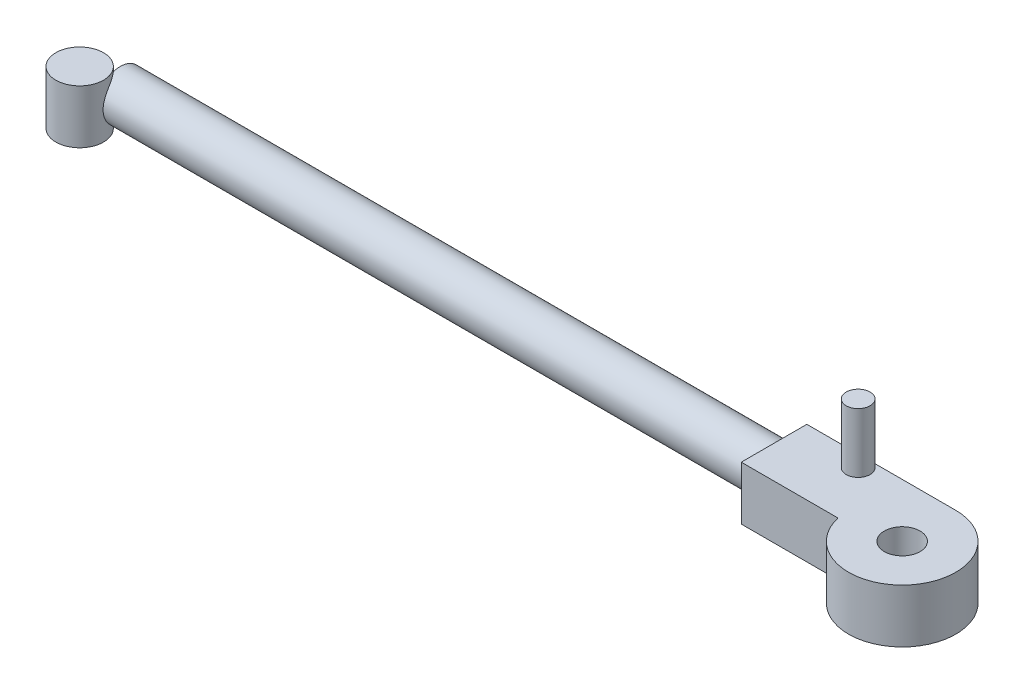
ISO-10303-21;
HEADER;
FILE_DESCRIPTION(('STEP AP214'),'2;1');
FILE_NAME('part.step','',(''),(''),'','','');
FILE_SCHEMA(('AUTOMOTIVE_DESIGN { 1 0 10303 214 1 1 1 1 }'));
ENDSEC;
DATA;
#1=APPLICATION_CONTEXT('core data for automotive mechanical design processes');
#2=APPLICATION_PROTOCOL_DEFINITION('international standard','automotive_design',2000,#1);
#3=PRODUCT_CONTEXT('',#1,'mechanical');
#4=PRODUCT('Part','Part','',(#3));
#5=PRODUCT_RELATED_PRODUCT_CATEGORY('part','',(#4));
#6=PRODUCT_DEFINITION_FORMATION('','',#4);
#7=PRODUCT_DEFINITION_CONTEXT('part definition',#1,'design');
#8=PRODUCT_DEFINITION('design','',#6,#7);
#9=PRODUCT_DEFINITION_SHAPE('','',#8);
#10=(LENGTH_UNIT() NAMED_UNIT(*) SI_UNIT(.MILLI.,.METRE.));
#11=(NAMED_UNIT(*) PLANE_ANGLE_UNIT() SI_UNIT($,.RADIAN.));
#12=(NAMED_UNIT(*) SI_UNIT($,.STERADIAN.) SOLID_ANGLE_UNIT());
#13=UNCERTAINTY_MEASURE_WITH_UNIT(LENGTH_MEASURE(1.E-05),#10,'distance_accuracy_value','');
#14=(GEOMETRIC_REPRESENTATION_CONTEXT(3) GLOBAL_UNCERTAINTY_ASSIGNED_CONTEXT((#13)) GLOBAL_UNIT_ASSIGNED_CONTEXT((#10,
#11,#12)) REPRESENTATION_CONTEXT('',''));
#15=CARTESIAN_POINT('',(0.,0.,0.));
#16=DIRECTION('',(0.,0.,1.));
#17=DIRECTION('',(1.,0.,0.));
#18=AXIS2_PLACEMENT_3D('',#15,#16,#17);
#19=CARTESIAN_POINT('',(-135.,4.74328423365478,-3.78478857369662));
#20=DIRECTION('',(1.,0.,0.));
#21=DIRECTION('',(0.,0.,-1.));
#22=AXIS2_PLACEMENT_3D('',#19,#20,#21);
#23=CYLINDRICAL_SURFACE('',#22,3.85262349560247);
#24=CARTESIAN_POINT('',(-25.,4.74328423365478,-3.78478857369658));
#25=DIRECTION('',(1.,0.,0.));
#26=DIRECTION('',(0.,0.,-1.));
#27=AXIS2_PLACEMENT_3D('',#24,#25,#26);
#28=CIRCLE('',#27,3.85262349560247);
#29=CARTESIAN_POINT('',(-25.,4.74328423365478,-7.63741206929905));
#30=VERTEX_POINT('',#29);
#31=EDGE_CURVE('E43',#30,#30,#28,.F.);
#32=ORIENTED_EDGE('',*,*,#31,.T.);
#33=EDGE_LOOP('',(#32));
#34=FACE_BOUND('',#33,.T.);
#35=CARTESIAN_POINT('',(-135.,1.06288997308922,-2.64575131106458));
#36=CARTESIAN_POINT('',(-134.943606676514,1.08265664730043,-2.58184082844176));
#37=CARTESIAN_POINT('',(-134.889631376872,1.10471910825381,-2.51648775943947));
#38=CARTESIAN_POINT('',(-134.78672829565,1.15377589624757,-2.38367274714249));
#39=CARTESIAN_POINT('',(-134.737801504059,1.18077118772905,-2.31621039359331));
#40=CARTESIAN_POINT('',(-134.64538650559,1.2399257369713,-2.18021030261975));
#41=CARTESIAN_POINT('',(-134.601880375926,1.27206712812292,-2.11167700052142));
#42=CARTESIAN_POINT('',(-134.520208441248,1.34175667532342,-1.97419350213062));
#43=CARTESIAN_POINT('',(-134.482041864109,1.37930404804451,-1.90524336762155));
#44=CARTESIAN_POINT('',(-134.410936314451,1.45995009583037,-1.76766295618624));
#45=CARTESIAN_POINT('',(-134.378008498998,1.50306027383837,-1.69903365625077));
#46=CARTESIAN_POINT('',(-134.317300929974,1.59471058146183,-1.56309688443208));
#47=CARTESIAN_POINT('',(-134.28952319808,1.64325283150981,-1.49578994087298));
#48=CARTESIAN_POINT('',(-134.238859072506,1.74552751627336,-1.3633932476687));
#49=CARTESIAN_POINT('',(-134.215969572147,1.79925662280118,-1.29830211203113));
#50=CARTESIAN_POINT('',(-134.174659551844,1.91166719587524,-1.17100444541195));
#51=CARTESIAN_POINT('',(-134.156240804846,1.9703506147374,-1.10879906670605));
#52=CARTESIAN_POINT('',(-134.123537793678,2.09185176586553,-0.988385167117746));
#53=CARTESIAN_POINT('',(-134.109223684032,2.15463535492963,-0.930150269827159));
#54=CARTESIAN_POINT('',(-134.084042420946,2.28435164710833,-0.817678638777406));
#55=CARTESIAN_POINT('',(-134.073176480346,2.35128580024528,-0.763443316943759));
#56=CARTESIAN_POINT('',(-134.044965588371,2.55778185174937,-0.607367893490012));
#57=CARTESIAN_POINT('',(-134.032005509207,2.7030456031453,-0.512150123301979));
#58=CARTESIAN_POINT('',(-134.012617018989,3.02374659549035,-0.331702393716801));
#59=CARTESIAN_POINT('',(-134.007174109197,3.20070518608334,-0.249093579176077));
#60=CARTESIAN_POINT('',(-134.00095805095,3.56523801055993,-0.111528767745784));
#61=CARTESIAN_POINT('',(-134.000186058576,3.75281486093224,-0.0565796198753316));
#62=CARTESIAN_POINT('',(-133.999948450588,4.04765779670299,0.00601925635413154));
#63=CARTESIAN_POINT('',(-134.000049892956,4.15287509142319,0.0238212807323373));
#64=CARTESIAN_POINT('',(-134.000296693803,4.36445302704649,0.0506452883912304));
#65=CARTESIAN_POINT('',(-134.000442054971,4.47081373755942,0.0596667340248698));
#66=CARTESIAN_POINT('',(-134.000590367886,4.68392193110348,0.0688544675444531));
#67=CARTESIAN_POINT('',(-134.000593305091,4.79066945251417,0.0690198512527872));
#68=CARTESIAN_POINT('',(-134.000455148778,5.00381078975653,0.0604952552712044));
#69=CARTESIAN_POINT('',(-134.00031405602,5.1102046074532,0.0518053223481299));
#70=CARTESIAN_POINT('',(-134.000058766123,5.32352647189183,0.0254284245893637));
#71=CARTESIAN_POINT('',(-133.999945013848,5.43043775755378,0.00760574621272882));
#72=CARTESIAN_POINT('',(-134.000108919298,5.64238172324931,-0.0369813765596569));
#73=CARTESIAN_POINT('',(-134.000386586221,5.74741435906984,-0.0637460311091809));
#74=CARTESIAN_POINT('',(-134.001864811945,5.95488393368964,-0.126036231781734));
#75=CARTESIAN_POINT('',(-134.003065692133,6.05731995573136,-0.16156482586168));
#76=CARTESIAN_POINT('',(-134.007076175629,6.25885952053703,-0.24113484695921));
#77=CARTESIAN_POINT('',(-134.009886558347,6.35796142410333,-0.285180391501667));
#78=CARTESIAN_POINT('',(-134.017919645168,6.55167021463186,-0.381247482868387));
#79=CARTESIAN_POINT('',(-134.023133430561,6.64629230629894,-0.43323907023291));
#80=CARTESIAN_POINT('',(-134.036880335786,6.83062065194853,-0.544829748617848));
#81=CARTESIAN_POINT('',(-134.045411522007,6.92032973488712,-0.604424394477378));
#82=CARTESIAN_POINT('',(-134.066764849127,7.09403528912956,-0.730580629394597));
#83=CARTESIAN_POINT('',(-134.079582544275,7.17803757108231,-0.797134951274335));
#84=CARTESIAN_POINT('',(-134.110513089401,7.33966253104738,-0.936472210764484));
#85=CARTESIAN_POINT('',(-134.128625218343,7.4172860759223,-1.00925429927567));
#86=CARTESIAN_POINT('',(-134.169417354527,7.55955818571368,-1.15405122193267));
#87=CARTESIAN_POINT('',(-134.191620911953,7.62474755998386,-1.22566874763973));
#88=CARTESIAN_POINT('',(-134.241988653957,7.74862853756064,-1.37235661784976));
#89=CARTESIAN_POINT('',(-134.270152751628,7.80732023558711,-1.44742691199742));
#90=CARTESIAN_POINT('',(-134.332957823839,7.91782379825937,-1.59987137421438));
#91=CARTESIAN_POINT('',(-134.367597288963,7.96963726142676,-1.67724500184698));
#92=CARTESIAN_POINT('',(-134.443654054828,8.06618596399595,-1.83301036678112));
#93=CARTESIAN_POINT('',(-134.485069497778,8.11092313693264,-1.91140181961385));
#94=CARTESIAN_POINT('',(-134.594369517258,8.21127556003738,-2.1019921184746));
#95=CARTESIAN_POINT('',(-134.665938571351,8.26317866404827,-2.21408964498685));
#96=CARTESIAN_POINT('',(-134.783602743233,8.33074476462111,-2.37894589849595));
#97=CARTESIAN_POINT('',(-134.824568114324,8.3515607117863,-2.43337887637825));
#98=CARTESIAN_POINT('',(-134.909820705549,8.38997585720985,-2.54076592851418));
#99=CARTESIAN_POINT('',(-134.954108129271,8.40757485809401,-2.59371991185606));
#100=CARTESIAN_POINT('',(-135.,8.42367849422034,-2.64575131106458));
#101=B_SPLINE_CURVE_WITH_KNOTS('',3,(#35,#36,#37,#38,#39,#40,#41,#42,#43,#44,#45,#46,#47,#48,
#49,#50,#51,#52,#53,#54,#55,#56,#57,#58,#59,#60,#61,#62,#63,#64,#65,#66,#67,#68,#69,#70,#71,#72,
#73,#74,#75,#76,#77,#78,#79,#80,#81,#82,#83,#84,#85,#86,#87,#88,#89,#90,#91,#92,#93,#94,#95,#96,
#97,#98,#99,#100),.UNSPECIFIED.,.F.,.F.,(4,2,2,2,2,2,2,2,2,2,2,2,2,2,2,2,2,2,2,2,2,2,2,2,2,2,2,
2,2,2,2,2,4),(0.,0.262434294699367,0.524919954179303,0.786513306815256,1.04806879259989,
1.31017406826571,1.57238201711561,1.83442282251915,2.09656737510342,2.3567544772708,
2.61703299500729,3.13755491549896,3.72135162878626,4.30529282936621,4.62511898578728,
4.94496472437691,5.2648431182039,5.58471982269265,5.90949405454127,6.23427591975086,
6.55917089850702,6.88422334242559,7.2080791512543,7.53174647672201,7.85507914648548,
8.17836780281419,8.47600580409694,8.77363946599083,9.07120383541307,9.3686867569726,
9.79534871815055,10.0089163841915,10.2224971491794),.UNSPECIFIED.);
#102=CARTESIAN_POINT('',(-135.,1.06288997308922,-2.64575131106458));
#103=VERTEX_POINT('',#102);
#104=CARTESIAN_POINT('',(-135.,8.42367849422033,-2.64575131106458));
#105=VERTEX_POINT('',#104);
#106=EDGE_CURVE('E49',#103,#105,#101,.T.);
#107=ORIENTED_EDGE('',*,*,#106,.F.);
#108=CARTESIAN_POINT('',(-135.,4.74328423365478,-3.78478857369662));
#109=DIRECTION('',(-1.,0.,0.));
#110=DIRECTION('',(0.,0.,1.));
#111=AXIS2_PLACEMENT_3D('',#108,#109,#110);
#112=CIRCLE('',#111,3.85262349560247);
#113=EDGE_CURVE('E165',#105,#103,#112,.T.);
#114=ORIENTED_EDGE('',*,*,#113,.F.);
#115=EDGE_LOOP('',(#107,#114));
#116=FACE_BOUND('',#115,.T.);
#117=ADVANCED_FACE('F35',(#34,#116),#23,.T.);
#118=CARTESIAN_POINT('',(-135.,4.74328423365478,-3.78478857369662));
#119=DIRECTION('',(-1.,0.,0.));
#120=DIRECTION('',(0.,0.,1.));
#121=AXIS2_PLACEMENT_3D('',#118,#119,#120);
#122=PLANE('',#121);
#123=ORIENTED_EDGE('',*,*,#113,.T.);
#124=DIRECTION('',(0.,-1.,0.));
#125=VECTOR('',#124,1.);
#126=CARTESIAN_POINT('',(-135.,20.3137084989848,-2.64575131106458));
#127=LINE('',#126,#125);
#128=EDGE_CURVE('E11',#103,#105,#127,.F.);
#129=ORIENTED_EDGE('',*,*,#128,.T.);
#130=EDGE_LOOP('',(#123,#129));
#131=FACE_BOUND('',#130,.T.);
#132=ADVANCED_FACE('F146',(#131),#122,.T.);
#133=CARTESIAN_POINT('',(0.,9.,2.));
#134=DIRECTION('',(0.,0.,-1.));
#135=DIRECTION('',(-1.,0.,0.));
#136=AXIS2_PLACEMENT_3D('',#133,#134,#135);
#137=PLANE('',#136);
#138=DIRECTION('',(1.,0.,0.));
#139=VECTOR('',#138,1.);
#140=CARTESIAN_POINT('',(0.,0.,2.));
#141=LINE('',#140,#139);
#142=CARTESIAN_POINT('',(-25.,0.,2.));
#143=VERTEX_POINT('',#142);
#144=CARTESIAN_POINT('',(-8.77496438739212,0.,2.));
#145=VERTEX_POINT('',#144);
#146=EDGE_CURVE('E111',#143,#145,#141,.T.);
#147=ORIENTED_EDGE('',*,*,#146,.T.);
#148=DIRECTION('',(0.,-1.,0.));
#149=VECTOR('',#148,1.);
#150=CARTESIAN_POINT('',(-8.77496438739212,9.,2.));
#151=LINE('',#150,#149);
#152=CARTESIAN_POINT('',(-8.77496438739212,9.,2.));
#153=VERTEX_POINT('',#152);
#154=EDGE_CURVE('E124',#153,#145,#151,.T.);
#155=ORIENTED_EDGE('',*,*,#154,.F.);
#156=DIRECTION('',(1.,0.,0.));
#157=VECTOR('',#156,1.);
#158=CARTESIAN_POINT('',(0.,9.,2.));
#159=LINE('',#158,#157);
#160=CARTESIAN_POINT('',(-25.,9.,2.));
#161=VERTEX_POINT('',#160);
#162=EDGE_CURVE('E105',#161,#153,#159,.T.);
#163=ORIENTED_EDGE('',*,*,#162,.F.);
#164=DIRECTION('',(0.,-1.,0.));
#165=VECTOR('',#164,1.);
#166=CARTESIAN_POINT('',(-25.,9.,2.));
#167=LINE('',#166,#165);
#168=EDGE_CURVE('E110',#161,#143,#167,.T.);
#169=ORIENTED_EDGE('',*,*,#168,.T.);
#170=EDGE_LOOP('',(#147,#155,#163,#169));
#171=FACE_BOUND('',#170,.T.);
#172=ADVANCED_FACE('F37',(#171),#137,.F.);
#173=CARTESIAN_POINT('',(0.,9.,0.));
#174=DIRECTION('',(0.,-1.,0.));
#175=DIRECTION('',(0.,0.,-1.));
#176=AXIS2_PLACEMENT_3D('',#173,#174,#175);
#177=CYLINDRICAL_SURFACE('',#176,9.);
#178=CARTESIAN_POINT('',(0.,0.,0.));
#179=DIRECTION('',(0.,1.,0.));
#180=DIRECTION('',(0.,0.,1.));
#181=AXIS2_PLACEMENT_3D('',#178,#179,#180);
#182=CIRCLE('',#181,9.);
#183=CARTESIAN_POINT('',(0.,0.,-9.));
#184=VERTEX_POINT('',#183);
#185=EDGE_CURVE('E114',#145,#184,#182,.T.);
#186=ORIENTED_EDGE('',*,*,#185,.T.);
#187=DIRECTION('',(0.,-1.,0.));
#188=VECTOR('',#187,1.);
#189=CARTESIAN_POINT('',(0.,9.,-9.));
#190=LINE('',#189,#188);
#191=CARTESIAN_POINT('',(0.,9.,-9.));
#192=VERTEX_POINT('',#191);
#193=EDGE_CURVE('E122',#192,#184,#190,.T.);
#194=ORIENTED_EDGE('',*,*,#193,.F.);
#195=CARTESIAN_POINT('',(0.,9.,0.));
#196=DIRECTION('',(0.,1.,0.));
#197=DIRECTION('',(0.,0.,1.));
#198=AXIS2_PLACEMENT_3D('',#195,#196,#197);
#199=CIRCLE('',#198,9.);
#200=EDGE_CURVE('E86',#153,#192,#199,.T.);
#201=ORIENTED_EDGE('',*,*,#200,.F.);
#202=ORIENTED_EDGE('',*,*,#154,.T.);
#203=EDGE_LOOP('',(#186,#194,#201,#202));
#204=FACE_BOUND('',#203,.T.);
#205=ADVANCED_FACE('F142',(#204),#177,.T.);
#206=CARTESIAN_POINT('',(0.,9.,-9.));
#207=DIRECTION('',(0.,0.,1.));
#208=DIRECTION('',(1.,0.,0.));
#209=AXIS2_PLACEMENT_3D('',#206,#207,#208);
#210=PLANE('',#209);
#211=DIRECTION('',(-1.,0.,0.));
#212=VECTOR('',#211,1.);
#213=CARTESIAN_POINT('',(0.,0.,-9.));
#214=LINE('',#213,#212);
#215=CARTESIAN_POINT('',(-25.,0.,-9.));
#216=VERTEX_POINT('',#215);
#217=EDGE_CURVE('E117',#184,#216,#214,.T.);
#218=ORIENTED_EDGE('',*,*,#217,.T.);
#219=DIRECTION('',(0.,-1.,0.));
#220=VECTOR('',#219,1.);
#221=CARTESIAN_POINT('',(-25.,9.,-9.));
#222=LINE('',#221,#220);
#223=CARTESIAN_POINT('',(-25.,9.,-9.));
#224=VERTEX_POINT('',#223);
#225=EDGE_CURVE('E104',#224,#216,#222,.T.);
#226=ORIENTED_EDGE('',*,*,#225,.F.);
#227=DIRECTION('',(-1.,0.,0.));
#228=VECTOR('',#227,1.);
#229=CARTESIAN_POINT('',(0.,9.,-9.));
#230=LINE('',#229,#228);
#231=CARTESIAN_POINT('',(-14.3874945699382,9.,-9.));
#232=VERTEX_POINT('',#231);
#233=EDGE_CURVE('E100',#232,#224,#230,.T.);
#234=ORIENTED_EDGE('',*,*,#233,.F.);
#235=EDGE_CURVE('E93',#192,#232,#230,.T.);
#236=ORIENTED_EDGE('',*,*,#235,.F.);
#237=ORIENTED_EDGE('',*,*,#193,.T.);
#238=EDGE_LOOP('',(#218,#226,#234,#236,#237));
#239=FACE_BOUND('',#238,.T.);
#240=ADVANCED_FACE('F103',(#239),#210,.F.);
#241=CARTESIAN_POINT('',(-25.,9.,0.));
#242=DIRECTION('',(1.,0.,0.));
#243=DIRECTION('',(0.,0.,-1.));
#244=AXIS2_PLACEMENT_3D('',#241,#242,#243);
#245=PLANE('',#244);
#246=ORIENTED_EDGE('',*,*,#31,.F.);
#247=EDGE_LOOP('',(#246));
#248=FACE_BOUND('',#247,.T.);
#249=DIRECTION('',(0.,0.,1.));
#250=VECTOR('',#249,1.);
#251=CARTESIAN_POINT('',(-25.,0.,0.));
#252=LINE('',#251,#250);
#253=EDGE_CURVE('E78',#216,#143,#252,.T.);
#254=ORIENTED_EDGE('',*,*,#253,.T.);
#255=ORIENTED_EDGE('',*,*,#168,.F.);
#256=DIRECTION('',(0.,0.,1.));
#257=VECTOR('',#256,1.);
#258=CARTESIAN_POINT('',(-25.,9.,0.));
#259=LINE('',#258,#257);
#260=EDGE_CURVE('E57',#224,#161,#259,.T.);
#261=ORIENTED_EDGE('',*,*,#260,.F.);
#262=ORIENTED_EDGE('',*,*,#225,.T.);
#263=EDGE_LOOP('',(#254,#255,#261,#262));
#264=FACE_BOUND('',#263,.T.);
#265=ADVANCED_FACE('F130',(#248,#264),#245,.F.);
#266=CARTESIAN_POINT('',(0.,9.,0.));
#267=DIRECTION('',(0.,1.,0.));
#268=DIRECTION('',(0.,0.,1.));
#269=AXIS2_PLACEMENT_3D('',#266,#267,#268);
#270=PLANE('',#269);
#271=CARTESIAN_POINT('',(0.,9.,0.));
#272=DIRECTION('',(0.,-1.,0.));
#273=DIRECTION('',(0.,0.,-1.));
#274=AXIS2_PLACEMENT_3D('',#271,#272,#273);
#275=CIRCLE('',#274,3.);
#276=CARTESIAN_POINT('',(0.,9.,-3.));
#277=VERTEX_POINT('',#276);
#278=EDGE_CURVE('E115',#277,#277,#275,.T.);
#279=ORIENTED_EDGE('',*,*,#278,.T.);
#280=EDGE_LOOP('',(#279));
#281=FACE_BOUND('',#280,.T.);
#282=ORIENTED_EDGE('',*,*,#235,.T.);
#283=CARTESIAN_POINT('',(-14.3874945699382,9.,-7.));
#284=DIRECTION('',(0.,1.,0.));
#285=DIRECTION('',(0.,0.,1.));
#286=AXIS2_PLACEMENT_3D('',#283,#284,#285);
#287=CIRCLE('',#286,2.);
#288=EDGE_CURVE('E97',#232,#232,#287,.T.);
#289=ORIENTED_EDGE('',*,*,#288,.F.);
#290=ORIENTED_EDGE('',*,*,#233,.T.);
#291=ORIENTED_EDGE('',*,*,#260,.T.);
#292=ORIENTED_EDGE('',*,*,#162,.T.);
#293=ORIENTED_EDGE('',*,*,#200,.T.);
#294=EDGE_LOOP('',(#282,#289,#290,#291,#292,#293));
#295=FACE_BOUND('',#294,.T.);
#296=ADVANCED_FACE('F95',(#281,#295),#270,.T.);
#297=CARTESIAN_POINT('',(0.,0.,0.));
#298=DIRECTION('',(0.,1.,0.));
#299=DIRECTION('',(0.,0.,1.));
#300=AXIS2_PLACEMENT_3D('',#297,#298,#299);
#301=PLANE('',#300);
#302=CARTESIAN_POINT('',(0.,0.,0.));
#303=DIRECTION('',(0.,-1.,0.));
#304=DIRECTION('',(0.,0.,-1.));
#305=AXIS2_PLACEMENT_3D('',#302,#303,#304);
#306=CIRCLE('',#305,3.);
#307=CARTESIAN_POINT('',(0.,0.,-3.));
#308=VERTEX_POINT('',#307);
#309=EDGE_CURVE('E281',#308,#308,#306,.T.);
#310=ORIENTED_EDGE('',*,*,#309,.F.);
#311=EDGE_LOOP('',(#310));
#312=FACE_BOUND('',#311,.T.);
#313=ORIENTED_EDGE('',*,*,#146,.F.);
#314=ORIENTED_EDGE('',*,*,#253,.F.);
#315=ORIENTED_EDGE('',*,*,#217,.F.);
#316=ORIENTED_EDGE('',*,*,#185,.F.);
#317=EDGE_LOOP('',(#313,#314,#315,#316));
#318=FACE_BOUND('',#317,.T.);
#319=ADVANCED_FACE('F138',(#312,#318),#301,.F.);
#320=CARTESIAN_POINT('',(0.,9.,0.));
#321=DIRECTION('',(0.,-1.,0.));
#322=DIRECTION('',(0.,0.,-1.));
#323=AXIS2_PLACEMENT_3D('',#320,#321,#322);
#324=CYLINDRICAL_SURFACE('',#323,3.);
#325=ORIENTED_EDGE('',*,*,#278,.F.);
#326=EDGE_LOOP('',(#325));
#327=FACE_BOUND('',#326,.T.);
#328=ORIENTED_EDGE('',*,*,#309,.T.);
#329=EDGE_LOOP('',(#328));
#330=FACE_BOUND('',#329,.T.);
#331=ADVANCED_FACE('F157',(#327,#330),#324,.F.);
#332=CARTESIAN_POINT('',(-138.,20.3137084989848,0.));
#333=DIRECTION('',(0.,-1.,0.));
#334=DIRECTION('',(0.,0.,-1.));
#335=AXIS2_PLACEMENT_3D('',#332,#333,#334);
#336=CYLINDRICAL_SURFACE('',#335,3.99999999999999);
#337=CARTESIAN_POINT('',(-138.,0.,0.));
#338=DIRECTION('',(0.,1.,0.));
#339=DIRECTION('',(0.,0.,1.));
#340=AXIS2_PLACEMENT_3D('',#337,#338,#339);
#341=CIRCLE('',#340,3.99999999999999);
#342=CARTESIAN_POINT('',(-138.,0.,3.99999999999999));
#343=VERTEX_POINT('',#342);
#344=EDGE_CURVE('E190',#343,#343,#341,.T.);
#345=ORIENTED_EDGE('',*,*,#344,.T.);
#346=EDGE_LOOP('',(#345));
#347=FACE_BOUND('',#346,.T.);
#348=CARTESIAN_POINT('',(-138.,9.,0.));
#349=DIRECTION('',(0.,1.,0.));
#350=DIRECTION('',(0.,0.,1.));
#351=AXIS2_PLACEMENT_3D('',#348,#349,#350);
#352=CIRCLE('',#351,3.99999999999999);
#353=CARTESIAN_POINT('',(-138.,9.,3.99999999999999));
#354=VERTEX_POINT('',#353);
#355=EDGE_CURVE('E166',#354,#354,#352,.T.);
#356=ORIENTED_EDGE('',*,*,#355,.F.);
#357=EDGE_LOOP('',(#356));
#358=FACE_BOUND('',#357,.T.);
#359=ORIENTED_EDGE('',*,*,#128,.F.);
#360=ORIENTED_EDGE('',*,*,#106,.T.);
#361=EDGE_LOOP('',(#359,#360));
#362=FACE_BOUND('',#361,.T.);
#363=ADVANCED_FACE('F169',(#347,#358,#362),#336,.T.);
#364=CARTESIAN_POINT('',(-138.,0.,0.));
#365=DIRECTION('',(0.,1.,0.));
#366=DIRECTION('',(0.,0.,1.));
#367=AXIS2_PLACEMENT_3D('',#364,#365,#366);
#368=PLANE('',#367);
#369=ORIENTED_EDGE('',*,*,#344,.F.);
#370=EDGE_LOOP('',(#369));
#371=FACE_BOUND('',#370,.T.);
#372=ADVANCED_FACE('F173',(#371),#368,.F.);
#373=CARTESIAN_POINT('',(0.,9.,0.));
#374=DIRECTION('',(0.,1.,0.));
#375=DIRECTION('',(0.,0.,1.));
#376=AXIS2_PLACEMENT_3D('',#373,#374,#375);
#377=PLANE('',#376);
#378=ORIENTED_EDGE('',*,*,#355,.T.);
#379=EDGE_LOOP('',(#378));
#380=FACE_BOUND('',#379,.T.);
#381=ADVANCED_FACE('F176',(#380),#377,.T.);
#382=CARTESIAN_POINT('',(-14.3874945699382,19.,-7.));
#383=DIRECTION('',(0.,-1.,0.));
#384=DIRECTION('',(0.,0.,-1.));
#385=AXIS2_PLACEMENT_3D('',#382,#383,#384);
#386=CYLINDRICAL_SURFACE('',#385,2.);
#387=CARTESIAN_POINT('',(-14.3874945699382,19.,-7.));
#388=DIRECTION('',(0.,1.,0.));
#389=DIRECTION('',(0.,0.,1.));
#390=AXIS2_PLACEMENT_3D('',#387,#388,#389);
#391=CIRCLE('',#390,2.);
#392=CARTESIAN_POINT('',(-14.3874945699382,19.,-5.));
#393=VERTEX_POINT('',#392);
#394=EDGE_CURVE('E192',#393,#393,#391,.T.);
#395=ORIENTED_EDGE('',*,*,#394,.F.);
#396=EDGE_LOOP('',(#395));
#397=FACE_BOUND('',#396,.T.);
#398=ORIENTED_EDGE('',*,*,#288,.T.);
#399=EDGE_LOOP('',(#398));
#400=FACE_BOUND('',#399,.T.);
#401=ADVANCED_FACE('F178',(#397,#400),#386,.T.);
#402=CARTESIAN_POINT('',(-14.3874945699382,19.,-7.));
#403=DIRECTION('',(0.,1.,0.));
#404=DIRECTION('',(0.,0.,1.));
#405=AXIS2_PLACEMENT_3D('',#402,#403,#404);
#406=PLANE('',#405);
#407=ORIENTED_EDGE('',*,*,#394,.T.);
#408=EDGE_LOOP('',(#407));
#409=FACE_BOUND('',#408,.T.);
#410=ADVANCED_FACE('F184',(#409),#406,.T.);
#411=CLOSED_SHELL('',(#117,#132,#172,#205,#240,#265,#296,#319,#331,#363,#372,#381,#401,#410));
#412=MANIFOLD_SOLID_BREP('B2',#411);
#413=ADVANCED_BREP_SHAPE_REPRESENTATION('',(#18,#412),#14);
#414=SHAPE_DEFINITION_REPRESENTATION(#9,#413);
ENDSEC;
END-ISO-10303-21;
